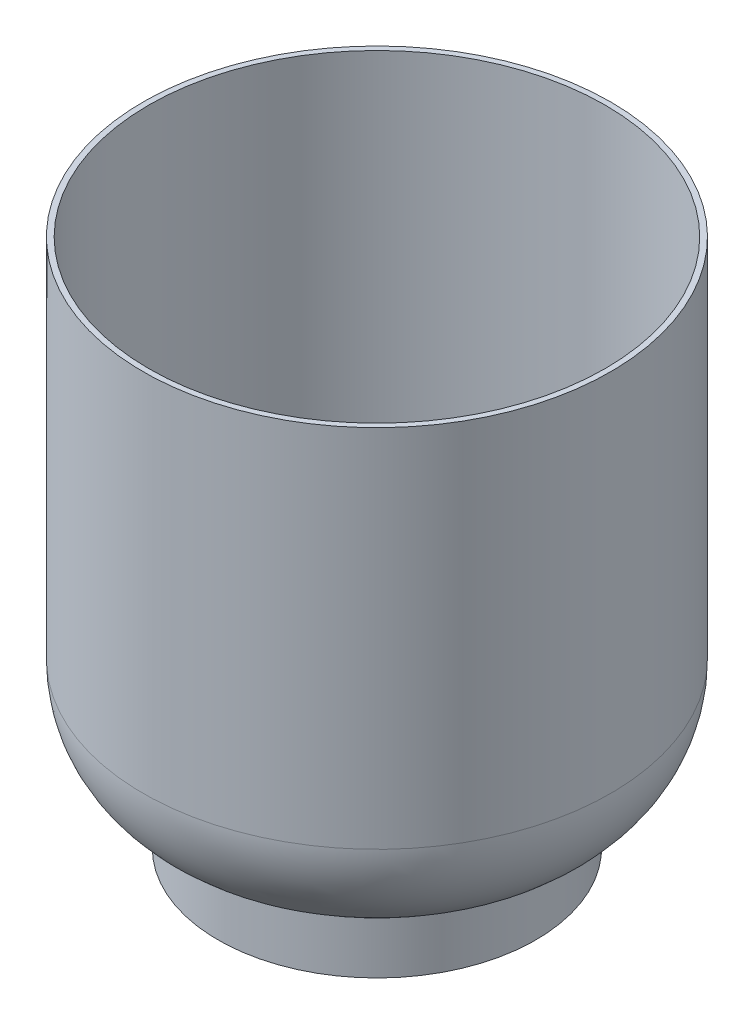
ISO-10303-21;
HEADER;
FILE_DESCRIPTION(('STEP AP214'),'2;1');
FILE_NAME('part.step','',(''),(''),'','','');
FILE_SCHEMA(('AUTOMOTIVE_DESIGN { 1 0 10303 214 1 1 1 1 }'));
ENDSEC;
DATA;
#1=APPLICATION_CONTEXT('core data for automotive mechanical design processes');
#2=APPLICATION_PROTOCOL_DEFINITION('international standard','automotive_design',2000,#1);
#3=PRODUCT_CONTEXT('',#1,'mechanical');
#4=PRODUCT('Part','Part','',(#3));
#5=PRODUCT_RELATED_PRODUCT_CATEGORY('part','',(#4));
#6=PRODUCT_DEFINITION_FORMATION('','',#4);
#7=PRODUCT_DEFINITION_CONTEXT('part definition',#1,'design');
#8=PRODUCT_DEFINITION('design','',#6,#7);
#9=PRODUCT_DEFINITION_SHAPE('','',#8);
#10=(LENGTH_UNIT() NAMED_UNIT(*) SI_UNIT(.MILLI.,.METRE.));
#11=(NAMED_UNIT(*) PLANE_ANGLE_UNIT() SI_UNIT($,.RADIAN.));
#12=(NAMED_UNIT(*) SI_UNIT($,.STERADIAN.) SOLID_ANGLE_UNIT());
#13=UNCERTAINTY_MEASURE_WITH_UNIT(LENGTH_MEASURE(1.E-05),#10,'distance_accuracy_value','');
#14=(GEOMETRIC_REPRESENTATION_CONTEXT(3) GLOBAL_UNCERTAINTY_ASSIGNED_CONTEXT((#13)) GLOBAL_UNIT_ASSIGNED_CONTEXT((#10,
#11,#12)) REPRESENTATION_CONTEXT('',''));
#15=CARTESIAN_POINT('',(0.,0.,0.));
#16=DIRECTION('',(0.,0.,1.));
#17=DIRECTION('',(1.,0.,0.));
#18=AXIS2_PLACEMENT_3D('',#15,#16,#17);
#19=CARTESIAN_POINT('',(-62.4999999999999,208.7140634362,0.));
#20=DIRECTION('',(0.,-1.,0.));
#21=DIRECTION('',(0.,0.,-1.));
#22=AXIS2_PLACEMENT_3D('',#19,#20,#21);
#23=PLANE('',#22);
#24=CARTESIAN_POINT('',(0.,208.7140634362,0.));
#25=DIRECTION('',(0.,-1.,0.));
#26=DIRECTION('',(0.,0.,-1.));
#27=AXIS2_PLACEMENT_3D('',#24,#25,#26);
#28=CIRCLE('',#27,63.9999999999999);
#29=CARTESIAN_POINT('',(0.,208.7140634362,-63.9999999999999));
#30=VERTEX_POINT('',#29);
#31=EDGE_CURVE('E10',#30,#30,#28,.T.);
#32=ORIENTED_EDGE('',*,*,#31,.F.);
#33=EDGE_LOOP('',(#32));
#34=FACE_BOUND('',#33,.T.);
#35=CARTESIAN_POINT('',(0.,208.7140634362,0.));
#36=DIRECTION('',(0.,-1.,0.));
#37=DIRECTION('',(0.,0.,-1.));
#38=AXIS2_PLACEMENT_3D('',#35,#36,#37);
#39=CIRCLE('',#38,62.4999999999999);
#40=CARTESIAN_POINT('',(0.,208.7140634362,-62.4999999999999));
#41=VERTEX_POINT('',#40);
#42=EDGE_CURVE('E65',#41,#41,#39,.T.);
#43=ORIENTED_EDGE('',*,*,#42,.T.);
#44=EDGE_LOOP('',(#43));
#45=FACE_BOUND('',#44,.T.);
#46=ADVANCED_FACE('F31',(#34,#45),#23,.F.);
#47=CARTESIAN_POINT('',(0.,0.,0.));
#48=DIRECTION('',(0.,-1.,0.));
#49=DIRECTION('',(0.,0.,-1.));
#50=AXIS2_PLACEMENT_3D('',#47,#48,#49);
#51=CYLINDRICAL_SURFACE('',#50,63.9999999999999);
#52=CARTESIAN_POINT('',(0.,108.7140634362,0.));
#53=DIRECTION('',(0.,-1.,0.));
#54=DIRECTION('',(0.,0.,-1.));
#55=AXIS2_PLACEMENT_3D('',#52,#53,#54);
#56=CIRCLE('',#55,64.);
#57=CARTESIAN_POINT('',(0.,108.7140634362,-64.));
#58=VERTEX_POINT('',#57);
#59=EDGE_CURVE('E37',#58,#58,#56,.T.);
#60=ORIENTED_EDGE('',*,*,#59,.F.);
#61=EDGE_LOOP('',(#60));
#62=FACE_BOUND('',#61,.T.);
#63=ORIENTED_EDGE('',*,*,#31,.T.);
#64=EDGE_LOOP('',(#63));
#65=FACE_BOUND('',#64,.T.);
#66=ADVANCED_FACE('F82',(#62,#65),#51,.T.);
#67=CARTESIAN_POINT('',(0.,108.7140634362,0.));
#68=DIRECTION('',(0.,-1.,0.));
#69=DIRECTION('',(0.,0.,-1.));
#70=AXIS2_PLACEMENT_3D('',#67,#68,#69);
#71=TOROIDAL_SURFACE('',#70,32.5,31.5);
#72=CARTESIAN_POINT('',(0.,79.5613326056925,0.));
#73=DIRECTION('',(0.,-1.,0.));
#74=DIRECTION('',(0.,0.,-1.));
#75=AXIS2_PLACEMENT_3D('',#72,#73,#74);
#76=CIRCLE('',#75,44.4318181818182);
#77=CARTESIAN_POINT('',(0.,79.5613326056925,-44.4318181818182));
#78=VERTEX_POINT('',#77);
#79=EDGE_CURVE('E41',#78,#78,#76,.T.);
#80=ORIENTED_EDGE('',*,*,#79,.F.);
#81=EDGE_LOOP('',(#80));
#82=FACE_BOUND('',#81,.T.);
#83=ORIENTED_EDGE('',*,*,#59,.T.);
#84=EDGE_LOOP('',(#83));
#85=FACE_BOUND('',#84,.T.);
#86=ADVANCED_FACE('F87',(#82,#85),#71,.T.);
#87=CARTESIAN_POINT('',(0.,78.1731073280492,0.));
#88=DIRECTION('',(0.,-1.,0.));
#89=DIRECTION('',(0.,0.,-1.));
#90=AXIS2_PLACEMENT_3D('',#87,#88,#89);
#91=TOROIDAL_SURFACE('',#90,45.,1.5);
#92=CARTESIAN_POINT('',(0.,78.1731073280492,0.));
#93=DIRECTION('',(0.,-1.,0.));
#94=DIRECTION('',(0.,0.,-1.));
#95=AXIS2_PLACEMENT_3D('',#92,#93,#94);
#96=CIRCLE('',#95,43.5);
#97=CARTESIAN_POINT('',(0.,78.1731073280492,-43.5));
#98=VERTEX_POINT('',#97);
#99=EDGE_CURVE('E45',#98,#98,#96,.T.);
#100=ORIENTED_EDGE('',*,*,#99,.F.);
#101=EDGE_LOOP('',(#100));
#102=FACE_BOUND('',#101,.T.);
#103=ORIENTED_EDGE('',*,*,#79,.T.);
#104=EDGE_LOOP('',(#103));
#105=FACE_BOUND('',#104,.T.);
#106=ADVANCED_FACE('F92',(#102,#105),#91,.F.);
#107=CARTESIAN_POINT('',(0.,0.,0.));
#108=DIRECTION('',(0.,-1.,0.));
#109=DIRECTION('',(0.,0.,-1.));
#110=AXIS2_PLACEMENT_3D('',#107,#108,#109);
#111=CYLINDRICAL_SURFACE('',#110,43.5);
#112=CARTESIAN_POINT('',(0.,63.7140634362001,0.));
#113=DIRECTION('',(0.,-1.,0.));
#114=DIRECTION('',(0.,0.,-1.));
#115=AXIS2_PLACEMENT_3D('',#112,#113,#114);
#116=CIRCLE('',#115,43.5);
#117=CARTESIAN_POINT('',(0.,63.7140634362001,-43.5));
#118=VERTEX_POINT('',#117);
#119=EDGE_CURVE('E50',#118,#118,#116,.T.);
#120=ORIENTED_EDGE('',*,*,#119,.F.);
#121=EDGE_LOOP('',(#120));
#122=FACE_BOUND('',#121,.T.);
#123=ORIENTED_EDGE('',*,*,#99,.T.);
#124=EDGE_LOOP('',(#123));
#125=FACE_BOUND('',#124,.T.);
#126=ADVANCED_FACE('F98',(#122,#125),#111,.T.);
#127=CARTESIAN_POINT('',(-42.,63.7140634362001,0.));
#128=DIRECTION('',(0.,-1.,0.));
#129=DIRECTION('',(0.,0.,-1.));
#130=AXIS2_PLACEMENT_3D('',#127,#128,#129);
#131=PLANE('',#130);
#132=ORIENTED_EDGE('',*,*,#119,.T.);
#133=EDGE_LOOP('',(#132));
#134=FACE_BOUND('',#133,.T.);
#135=CARTESIAN_POINT('',(0.,63.7140634362001,0.));
#136=DIRECTION('',(0.,-1.,0.));
#137=DIRECTION('',(0.,0.,-1.));
#138=AXIS2_PLACEMENT_3D('',#135,#136,#137);
#139=CIRCLE('',#138,42.);
#140=CARTESIAN_POINT('',(0.,63.7140634362001,-42.));
#141=VERTEX_POINT('',#140);
#142=EDGE_CURVE('E53',#141,#141,#139,.T.);
#143=ORIENTED_EDGE('',*,*,#142,.F.);
#144=EDGE_LOOP('',(#143));
#145=FACE_BOUND('',#144,.T.);
#146=ADVANCED_FACE('F102',(#134,#145),#131,.T.);
#147=CARTESIAN_POINT('',(0.,0.,0.));
#148=DIRECTION('',(0.,-1.,0.));
#149=DIRECTION('',(0.,0.,-1.));
#150=AXIS2_PLACEMENT_3D('',#147,#148,#149);
#151=CYLINDRICAL_SURFACE('',#150,42.);
#152=ORIENTED_EDGE('',*,*,#142,.T.);
#153=EDGE_LOOP('',(#152));
#154=FACE_BOUND('',#153,.T.);
#155=CARTESIAN_POINT('',(0.,79.1971191499092,0.));
#156=DIRECTION('',(0.,-1.,0.));
#157=DIRECTION('',(0.,0.,-1.));
#158=AXIS2_PLACEMENT_3D('',#155,#156,#157);
#159=CIRCLE('',#158,42.);
#160=CARTESIAN_POINT('',(0.,79.1971191499092,-42.));
#161=VERTEX_POINT('',#160);
#162=EDGE_CURVE('E56',#161,#161,#159,.T.);
#163=ORIENTED_EDGE('',*,*,#162,.F.);
#164=EDGE_LOOP('',(#163));
#165=FACE_BOUND('',#164,.T.);
#166=ADVANCED_FACE('F106',(#154,#165),#151,.F.);
#167=CARTESIAN_POINT('',(0.,79.1971191499092,0.));
#168=DIRECTION('',(0.,-1.,0.));
#169=DIRECTION('',(0.,0.,-1.));
#170=AXIS2_PLACEMENT_3D('',#167,#168,#169);
#171=TOROIDAL_SURFACE('',#170,43.5,1.50000000000001);
#172=CARTESIAN_POINT('',(0.,80.6026879254469,0.));
#173=DIRECTION('',(0.,-1.,0.));
#174=DIRECTION('',(0.,0.,-1.));
#175=AXIS2_PLACEMENT_3D('',#172,#173,#174);
#176=CIRCLE('',#175,42.9761904761905);
#177=CARTESIAN_POINT('',(0.,80.6026879254469,-42.9761904761905));
#178=VERTEX_POINT('',#177);
#179=EDGE_CURVE('E59',#178,#178,#176,.T.);
#180=ORIENTED_EDGE('',*,*,#179,.F.);
#181=EDGE_LOOP('',(#180));
#182=FACE_BOUND('',#181,.T.);
#183=ORIENTED_EDGE('',*,*,#162,.T.);
#184=EDGE_LOOP('',(#183));
#185=FACE_BOUND('',#184,.T.);
#186=ADVANCED_FACE('F78',(#182,#185),#171,.T.);
#187=CARTESIAN_POINT('',(0.,108.7140634362,0.));
#188=DIRECTION('',(0.,-1.,0.));
#189=DIRECTION('',(0.,0.,-1.));
#190=AXIS2_PLACEMENT_3D('',#187,#188,#189);
#191=TOROIDAL_SURFACE('',#190,32.5,30.);
#192=ORIENTED_EDGE('',*,*,#179,.T.);
#193=EDGE_LOOP('',(#192));
#194=FACE_BOUND('',#193,.T.);
#195=CARTESIAN_POINT('',(0.,108.7140634362,0.));
#196=DIRECTION('',(0.,-1.,0.));
#197=DIRECTION('',(0.,0.,-1.));
#198=AXIS2_PLACEMENT_3D('',#195,#196,#197);
#199=CIRCLE('',#198,62.4999999999999);
#200=CARTESIAN_POINT('',(0.,108.7140634362,-62.4999999999999));
#201=VERTEX_POINT('',#200);
#202=EDGE_CURVE('E62',#201,#201,#199,.T.);
#203=ORIENTED_EDGE('',*,*,#202,.F.);
#204=EDGE_LOOP('',(#203));
#205=FACE_BOUND('',#204,.T.);
#206=ADVANCED_FACE('F72',(#194,#205),#191,.F.);
#207=CARTESIAN_POINT('',(0.,0.,0.));
#208=DIRECTION('',(0.,-1.,0.));
#209=DIRECTION('',(0.,0.,-1.));
#210=AXIS2_PLACEMENT_3D('',#207,#208,#209);
#211=CYLINDRICAL_SURFACE('',#210,62.4999999999999);
#212=ORIENTED_EDGE('',*,*,#202,.T.);
#213=EDGE_LOOP('',(#212));
#214=FACE_BOUND('',#213,.T.);
#215=ORIENTED_EDGE('',*,*,#42,.F.);
#216=EDGE_LOOP('',(#215));
#217=FACE_BOUND('',#216,.T.);
#218=ADVANCED_FACE('F70',(#214,#217),#211,.F.);
#219=CLOSED_SHELL('',(#46,#66,#86,#106,#126,#146,#166,#186,#206,#218));
#220=MANIFOLD_SOLID_BREP('B2',#219);
#221=ADVANCED_BREP_SHAPE_REPRESENTATION('',(#18,#220),#14);
#222=SHAPE_DEFINITION_REPRESENTATION(#9,#221);
ENDSEC;
END-ISO-10303-21;
